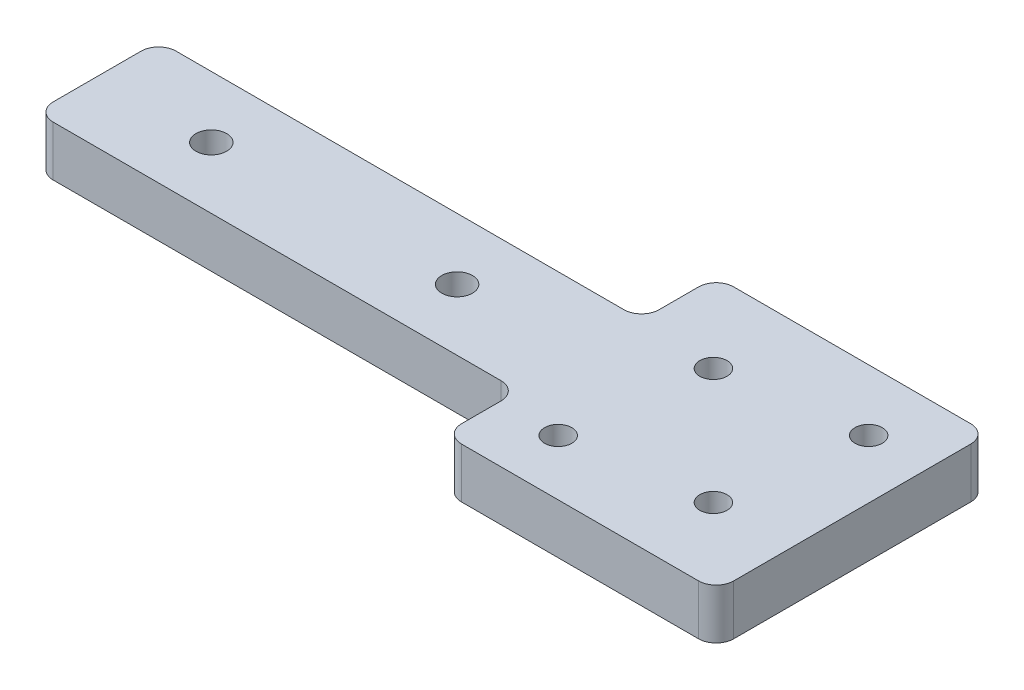
ISO-10303-21;
HEADER;
FILE_DESCRIPTION(('STEP AP214'),'2;1');
FILE_NAME('part.step','',(''),(''),'','','');
FILE_SCHEMA(('AUTOMOTIVE_DESIGN { 1 0 10303 214 1 1 1 1 }'));
ENDSEC;
DATA;
#1=APPLICATION_CONTEXT('core data for automotive mechanical design processes');
#2=APPLICATION_PROTOCOL_DEFINITION('international standard','automotive_design',2000,#1);
#3=PRODUCT_CONTEXT('',#1,'mechanical');
#4=PRODUCT('Part','Part','',(#3));
#5=PRODUCT_RELATED_PRODUCT_CATEGORY('part','',(#4));
#6=PRODUCT_DEFINITION_FORMATION('','',#4);
#7=PRODUCT_DEFINITION_CONTEXT('part definition',#1,'design');
#8=PRODUCT_DEFINITION('design','',#6,#7);
#9=PRODUCT_DEFINITION_SHAPE('','',#8);
#10=(LENGTH_UNIT() NAMED_UNIT(*) SI_UNIT(.MILLI.,.METRE.));
#11=(NAMED_UNIT(*) PLANE_ANGLE_UNIT() SI_UNIT($,.RADIAN.));
#12=(NAMED_UNIT(*) SI_UNIT($,.STERADIAN.) SOLID_ANGLE_UNIT());
#13=UNCERTAINTY_MEASURE_WITH_UNIT(LENGTH_MEASURE(1.E-05),#10,'distance_accuracy_value','');
#14=(GEOMETRIC_REPRESENTATION_CONTEXT(3) GLOBAL_UNCERTAINTY_ASSIGNED_CONTEXT((#13)) GLOBAL_UNIT_ASSIGNED_CONTEXT((#10,
#11,#12)) REPRESENTATION_CONTEXT('',''));
#15=CARTESIAN_POINT('',(0.,0.,0.));
#16=DIRECTION('',(0.,0.,1.));
#17=DIRECTION('',(1.,0.,0.));
#18=AXIS2_PLACEMENT_3D('',#15,#16,#17);
#19=CARTESIAN_POINT('',(-4.44992328999122,5.715,-7.31043064824472));
#20=DIRECTION('',(1.,0.,0.));
#21=DIRECTION('',(0.,0.,-1.));
#22=AXIS2_PLACEMENT_3D('',#19,#20,#21);
#23=PLANE('',#22);
#24=DIRECTION('',(0.,0.,1.));
#25=VECTOR('',#24,1.);
#26=CARTESIAN_POINT('',(-4.44992328999122,5.715,-7.31043064824472));
#27=LINE('',#26,#25);
#28=CARTESIAN_POINT('',(-4.44992328999122,5.715,-5.31043064824472));
#29=VERTEX_POINT('',#28);
#30=CARTESIAN_POINT('',(-4.44992328999122,5.715,4.68956935175528));
#31=VERTEX_POINT('',#30);
#32=EDGE_CURVE('E164',#29,#31,#27,.T.);
#33=ORIENTED_EDGE('',*,*,#32,.F.);
#34=DIRECTION('',(0.,-1.,0.));
#35=VECTOR('',#34,1.);
#36=CARTESIAN_POINT('',(-4.44992328999122,5.715,-5.31043064824472));
#37=LINE('',#36,#35);
#38=CARTESIAN_POINT('',(-4.44992328999122,0.,-5.31043064824472));
#39=VERTEX_POINT('',#38);
#40=EDGE_CURVE('E149',#29,#39,#37,.T.);
#41=ORIENTED_EDGE('',*,*,#40,.T.);
#42=DIRECTION('',(0.,0.,1.));
#43=VECTOR('',#42,1.);
#44=CARTESIAN_POINT('',(-4.44992328999122,0.,-7.31043064824472));
#45=LINE('',#44,#43);
#46=CARTESIAN_POINT('',(-4.44992328999122,0.,4.68956935175528));
#47=VERTEX_POINT('',#46);
#48=EDGE_CURVE('E161',#39,#47,#45,.T.);
#49=ORIENTED_EDGE('',*,*,#48,.T.);
#50=DIRECTION('',(0.,-1.,0.));
#51=VECTOR('',#50,1.);
#52=CARTESIAN_POINT('',(-4.44992328999122,5.715,4.68956935175528));
#53=LINE('',#52,#51);
#54=EDGE_CURVE('E166',#47,#31,#53,.F.);
#55=ORIENTED_EDGE('',*,*,#54,.T.);
#56=EDGE_LOOP('',(#33,#41,#49,#55));
#57=FACE_BOUND('',#56,.T.);
#58=ADVANCED_FACE('F32',(#57),#23,.F.);
#59=CARTESIAN_POINT('',(-4.44992328999122,5.715,6.68956935175528));
#60=DIRECTION('',(0.,0.,-1.));
#61=DIRECTION('',(-1.,0.,0.));
#62=AXIS2_PLACEMENT_3D('',#59,#60,#61);
#63=PLANE('',#62);
#64=DIRECTION('',(1.,0.,0.));
#65=VECTOR('',#64,1.);
#66=CARTESIAN_POINT('',(-4.44992328999122,5.715,6.68956935175528));
#67=LINE('',#66,#65);
#68=CARTESIAN_POINT('',(-2.44992328999122,5.715,6.68956935175528));
#69=VERTEX_POINT('',#68);
#70=CARTESIAN_POINT('',(48.5500767100088,5.715,6.68956935175528));
#71=VERTEX_POINT('',#70);
#72=EDGE_CURVE('E202',#69,#71,#67,.T.);
#73=ORIENTED_EDGE('',*,*,#72,.F.);
#74=DIRECTION('',(0.,-1.,0.));
#75=VECTOR('',#74,1.);
#76=CARTESIAN_POINT('',(-2.44992328999122,5.715,6.68956935175528));
#77=LINE('',#76,#75);
#78=CARTESIAN_POINT('',(-2.44992328999122,0.,6.68956935175528));
#79=VERTEX_POINT('',#78);
#80=EDGE_CURVE('E258',#69,#79,#77,.T.);
#81=ORIENTED_EDGE('',*,*,#80,.T.);
#82=DIRECTION('',(1.,0.,0.));
#83=VECTOR('',#82,1.);
#84=CARTESIAN_POINT('',(-4.44992328999122,0.,6.68956935175528));
#85=LINE('',#84,#83);
#86=CARTESIAN_POINT('',(48.5500767100088,0.,6.68956935175528));
#87=VERTEX_POINT('',#86);
#88=EDGE_CURVE('E170',#79,#87,#85,.T.);
#89=ORIENTED_EDGE('',*,*,#88,.T.);
#90=DIRECTION('',(0.,-1.,0.));
#91=VECTOR('',#90,1.);
#92=CARTESIAN_POINT('',(48.5500767100088,5.715,6.68956935175528));
#93=LINE('',#92,#91);
#94=EDGE_CURVE('E255',#87,#71,#93,.F.);
#95=ORIENTED_EDGE('',*,*,#94,.T.);
#96=EDGE_LOOP('',(#73,#81,#89,#95));
#97=FACE_BOUND('',#96,.T.);
#98=ADVANCED_FACE('F298',(#97),#63,.F.);
#99=CARTESIAN_POINT('',(-4.44992328999122,5.715,-7.31043064824472));
#100=DIRECTION('',(0.,0.,1.));
#101=DIRECTION('',(1.,0.,0.));
#102=AXIS2_PLACEMENT_3D('',#99,#100,#101);
#103=PLANE('',#102);
#104=DIRECTION('',(-1.,0.,0.));
#105=VECTOR('',#104,1.);
#106=CARTESIAN_POINT('',(-4.44992328999122,0.,-7.31043064824472));
#107=LINE('',#106,#105);
#108=CARTESIAN_POINT('',(48.5500767100088,0.,-7.31043064824472));
#109=VERTEX_POINT('',#108);
#110=CARTESIAN_POINT('',(-2.44992328999122,0.,-7.31043064824472));
#111=VERTEX_POINT('',#110);
#112=EDGE_CURVE('E174',#109,#111,#107,.T.);
#113=ORIENTED_EDGE('',*,*,#112,.T.);
#114=DIRECTION('',(0.,-1.,0.));
#115=VECTOR('',#114,1.);
#116=CARTESIAN_POINT('',(-2.44992328999122,5.715,-7.31043064824472));
#117=LINE('',#116,#115);
#118=CARTESIAN_POINT('',(-2.44992328999122,5.715,-7.31043064824472));
#119=VERTEX_POINT('',#118);
#120=EDGE_CURVE('E150',#111,#119,#117,.F.);
#121=ORIENTED_EDGE('',*,*,#120,.T.);
#122=DIRECTION('',(-1.,0.,0.));
#123=VECTOR('',#122,1.);
#124=CARTESIAN_POINT('',(-4.44992328999122,5.715,-7.31043064824472));
#125=LINE('',#124,#123);
#126=CARTESIAN_POINT('',(48.5500767100088,5.715,-7.31043064824472));
#127=VERTEX_POINT('',#126);
#128=EDGE_CURVE('E199',#127,#119,#125,.T.);
#129=ORIENTED_EDGE('',*,*,#128,.F.);
#130=DIRECTION('',(0.,-1.,0.));
#131=VECTOR('',#130,1.);
#132=CARTESIAN_POINT('',(48.5500767100088,5.715,-7.31043064824472));
#133=LINE('',#132,#131);
#134=EDGE_CURVE('E155',#127,#109,#133,.T.);
#135=ORIENTED_EDGE('',*,*,#134,.T.);
#136=EDGE_LOOP('',(#113,#121,#129,#135));
#137=FACE_BOUND('',#136,.T.);
#138=ADVANCED_FACE('F245',(#137),#103,.F.);
#139=CARTESIAN_POINT('',(0.,5.715,0.));
#140=DIRECTION('',(0.,1.,0.));
#141=DIRECTION('',(0.,0.,1.));
#142=AXIS2_PLACEMENT_3D('',#139,#140,#141);
#143=PLANE('',#142);
#144=CARTESIAN_POINT('',(72.661525114103,5.715,6.61144840409427));
#145=DIRECTION('',(0.,1.,0.));
#146=DIRECTION('',(0.,0.,1.));
#147=AXIS2_PLACEMENT_3D('',#144,#145,#146);
#148=CIRCLE('',#147,1.55);
#149=CARTESIAN_POINT('',(72.661525114103,5.715,8.16144840409427));
#150=VERTEX_POINT('',#149);
#151=EDGE_CURVE('E352',#150,#150,#148,.T.);
#152=ORIENTED_EDGE('',*,*,#151,.F.);
#153=EDGE_LOOP('',(#152));
#154=FACE_BOUND('',#153,.T.);
#155=CARTESIAN_POINT('',(74.8889114748407,5.715,-8.83883476483178));
#156=DIRECTION('',(0.,1.,0.));
#157=DIRECTION('',(0.,0.,1.));
#158=AXIS2_PLACEMENT_3D('',#155,#156,#157);
#159=CIRCLE('',#158,1.54999999999998);
#160=CARTESIAN_POINT('',(74.8889114748407,5.715,-7.28883476483179));
#161=VERTEX_POINT('',#160);
#162=EDGE_CURVE('E348',#161,#161,#159,.T.);
#163=ORIENTED_EDGE('',*,*,#162,.F.);
#164=EDGE_LOOP('',(#163));
#165=FACE_BOUND('',#164,.T.);
#166=CARTESIAN_POINT('',(59.4386283059146,5.715,-6.61144840409424));
#167=DIRECTION('',(0.,1.,0.));
#168=DIRECTION('',(0.,0.,1.));
#169=AXIS2_PLACEMENT_3D('',#166,#167,#168);
#170=CIRCLE('',#169,1.54999999999999);
#171=CARTESIAN_POINT('',(59.4386283059146,5.715,-5.06144840409425));
#172=VERTEX_POINT('',#171);
#173=EDGE_CURVE('E344',#172,#172,#170,.T.);
#174=ORIENTED_EDGE('',*,*,#173,.F.);
#175=EDGE_LOOP('',(#174));
#176=FACE_BOUND('',#175,.T.);
#177=CARTESIAN_POINT('',(57.2112419451769,5.715,8.8388347648318));
#178=DIRECTION('',(0.,1.,0.));
#179=DIRECTION('',(0.,0.,1.));
#180=AXIS2_PLACEMENT_3D('',#177,#178,#179);
#181=CIRCLE('',#180,1.55000000000001);
#182=CARTESIAN_POINT('',(57.2112419451769,5.715,10.3888347648318));
#183=VERTEX_POINT('',#182);
#184=EDGE_CURVE('E313',#183,#183,#181,.T.);
#185=ORIENTED_EDGE('',*,*,#184,.F.);
#186=EDGE_LOOP('',(#185));
#187=FACE_BOUND('',#186,.T.);
#188=CARTESIAN_POINT('',(36.5500767100088,5.715,-0.310430648244709));
#189=DIRECTION('',(0.,1.,0.));
#190=DIRECTION('',(0.,0.,1.));
#191=AXIS2_PLACEMENT_3D('',#188,#189,#190);
#192=CIRCLE('',#191,1.75);
#193=CARTESIAN_POINT('',(36.5500767100088,5.715,1.43956935175529));
#194=VERTEX_POINT('',#193);
#195=EDGE_CURVE('E233',#194,#194,#192,.T.);
#196=ORIENTED_EDGE('',*,*,#195,.F.);
#197=EDGE_LOOP('',(#196));
#198=FACE_BOUND('',#197,.T.);
#199=CARTESIAN_POINT('',(8.55007671000879,5.715,-0.31043064824469));
#200=DIRECTION('',(0.,1.,0.));
#201=DIRECTION('',(0.,0.,1.));
#202=AXIS2_PLACEMENT_3D('',#199,#200,#201);
#203=CIRCLE('',#202,1.75);
#204=CARTESIAN_POINT('',(8.55007671000879,5.715,1.43956935175531));
#205=VERTEX_POINT('',#204);
#206=EDGE_CURVE('E177',#205,#205,#203,.T.);
#207=ORIENTED_EDGE('',*,*,#206,.F.);
#208=EDGE_LOOP('',(#207));
#209=FACE_BOUND('',#208,.T.);
#210=ORIENTED_EDGE('',*,*,#128,.T.);
#211=CARTESIAN_POINT('',(-2.44992328999122,5.715,-5.31043064824472));
#212=DIRECTION('',(0.,1.,0.));
#213=DIRECTION('',(0.,0.,1.));
#214=AXIS2_PLACEMENT_3D('',#211,#212,#213);
#215=CIRCLE('',#214,2.);
#216=EDGE_CURVE('E249',#119,#29,#215,.T.);
#217=ORIENTED_EDGE('',*,*,#216,.T.);
#218=ORIENTED_EDGE('',*,*,#32,.T.);
#219=CARTESIAN_POINT('',(-2.44992328999122,5.715,4.68956935175528));
#220=DIRECTION('',(0.,1.,0.));
#221=DIRECTION('',(0.,0.,1.));
#222=AXIS2_PLACEMENT_3D('',#219,#220,#221);
#223=CIRCLE('',#222,2.);
#224=EDGE_CURVE('E256',#31,#69,#223,.T.);
#225=ORIENTED_EDGE('',*,*,#224,.T.);
#226=ORIENTED_EDGE('',*,*,#72,.T.);
#227=CARTESIAN_POINT('',(48.5500767100088,5.715,8.68956935175528));
#228=DIRECTION('',(0.,1.,0.));
#229=DIRECTION('',(0.,0.,1.));
#230=AXIS2_PLACEMENT_3D('',#227,#228,#229);
#231=CIRCLE('',#230,2.);
#232=CARTESIAN_POINT('',(50.5500767100088,5.715,8.68956935175528));
#233=VERTEX_POINT('',#232);
#234=EDGE_CURVE('E11',#71,#233,#231,.F.);
#235=ORIENTED_EDGE('',*,*,#234,.T.);
#236=DIRECTION('',(0.,0.,1.));
#237=VECTOR('',#236,1.);
#238=CARTESIAN_POINT('',(50.5500767100088,5.715,-15.8104306482447));
#239=LINE('',#238,#237);
#240=CARTESIAN_POINT('',(50.5500767100088,5.715,13.1895693517553));
#241=VERTEX_POINT('',#240);
#242=EDGE_CURVE('E305',#233,#241,#239,.T.);
#243=ORIENTED_EDGE('',*,*,#242,.T.);
#244=CARTESIAN_POINT('',(52.5500767100088,5.715,13.1895693517553));
#245=DIRECTION('',(0.,1.,0.));
#246=DIRECTION('',(0.,0.,1.));
#247=AXIS2_PLACEMENT_3D('',#244,#245,#246);
#248=CIRCLE('',#247,2.);
#249=CARTESIAN_POINT('',(52.5500767100088,5.715,15.1895693517553));
#250=VERTEX_POINT('',#249);
#251=EDGE_CURVE('E316',#241,#250,#248,.T.);
#252=ORIENTED_EDGE('',*,*,#251,.T.);
#253=DIRECTION('',(-1.,0.,0.));
#254=VECTOR('',#253,1.);
#255=CARTESIAN_POINT('',(81.5500767100088,5.715,15.1895693517553));
#256=LINE('',#255,#254);
#257=CARTESIAN_POINT('',(79.5500767100088,5.715,15.1895693517553));
#258=VERTEX_POINT('',#257);
#259=EDGE_CURVE('E228',#258,#250,#256,.T.);
#260=ORIENTED_EDGE('',*,*,#259,.F.);
#261=CARTESIAN_POINT('',(79.5500767100088,5.715,13.1895693517553));
#262=DIRECTION('',(0.,1.,0.));
#263=DIRECTION('',(0.,0.,1.));
#264=AXIS2_PLACEMENT_3D('',#261,#262,#263);
#265=CIRCLE('',#264,2.);
#266=CARTESIAN_POINT('',(81.5500767100088,5.715,13.1895693517553));
#267=VERTEX_POINT('',#266);
#268=EDGE_CURVE('E318',#258,#267,#265,.T.);
#269=ORIENTED_EDGE('',*,*,#268,.T.);
#270=DIRECTION('',(0.,0.,1.));
#271=VECTOR('',#270,1.);
#272=CARTESIAN_POINT('',(81.5500767100088,5.715,-15.8104306482447));
#273=LINE('',#272,#271);
#274=CARTESIAN_POINT('',(81.5500767100088,5.715,-13.8104306482447));
#275=VERTEX_POINT('',#274);
#276=EDGE_CURVE('E324',#275,#267,#273,.T.);
#277=ORIENTED_EDGE('',*,*,#276,.F.);
#278=CARTESIAN_POINT('',(79.5500767100088,5.715,-13.8104306482447));
#279=DIRECTION('',(0.,1.,0.));
#280=DIRECTION('',(0.,0.,1.));
#281=AXIS2_PLACEMENT_3D('',#278,#279,#280);
#282=CIRCLE('',#281,2.);
#283=CARTESIAN_POINT('',(79.5500767100088,5.715,-15.8104306482447));
#284=VERTEX_POINT('',#283);
#285=EDGE_CURVE('E320',#275,#284,#282,.T.);
#286=ORIENTED_EDGE('',*,*,#285,.T.);
#287=DIRECTION('',(-1.,0.,0.));
#288=VECTOR('',#287,1.);
#289=CARTESIAN_POINT('',(81.5500767100088,5.715,-15.8104306482447));
#290=LINE('',#289,#288);
#291=CARTESIAN_POINT('',(52.5500767100088,5.715,-15.8104306482447));
#292=VERTEX_POINT('',#291);
#293=EDGE_CURVE('E231',#284,#292,#290,.T.);
#294=ORIENTED_EDGE('',*,*,#293,.T.);
#295=CARTESIAN_POINT('',(52.5500767100088,5.715,-13.8104306482447));
#296=DIRECTION('',(0.,1.,0.));
#297=DIRECTION('',(0.,0.,1.));
#298=AXIS2_PLACEMENT_3D('',#295,#296,#297);
#299=CIRCLE('',#298,2.);
#300=CARTESIAN_POINT('',(50.5500767100088,5.715,-13.8104306482447));
#301=VERTEX_POINT('',#300);
#302=EDGE_CURVE('E54',#292,#301,#299,.T.);
#303=ORIENTED_EDGE('',*,*,#302,.T.);
#304=CARTESIAN_POINT('',(50.5500767100088,5.715,-9.31043064824472));
#305=VERTEX_POINT('',#304);
#306=EDGE_CURVE('E214',#301,#305,#239,.T.);
#307=ORIENTED_EDGE('',*,*,#306,.T.);
#308=CARTESIAN_POINT('',(48.5500767100088,5.715,-9.31043064824472));
#309=DIRECTION('',(0.,1.,0.));
#310=DIRECTION('',(0.,0.,1.));
#311=AXIS2_PLACEMENT_3D('',#308,#309,#310);
#312=CIRCLE('',#311,2.);
#313=EDGE_CURVE('E251',#305,#127,#312,.F.);
#314=ORIENTED_EDGE('',*,*,#313,.T.);
#315=EDGE_LOOP('',(#210,#217,#218,#225,#226,#235,#243,#252,#260,#269,#277,#286,#294,#303,#307,#314));
#316=FACE_BOUND('',#315,.T.);
#317=ADVANCED_FACE('F243',(#154,#165,#176,#187,#198,#209,#316),#143,.T.);
#318=CARTESIAN_POINT('',(0.,0.,0.));
#319=DIRECTION('',(0.,1.,0.));
#320=DIRECTION('',(0.,0.,1.));
#321=AXIS2_PLACEMENT_3D('',#318,#319,#320);
#322=PLANE('',#321);
#323=CARTESIAN_POINT('',(72.661525114103,0.,6.61144840409427));
#324=DIRECTION('',(0.,1.,0.));
#325=DIRECTION('',(0.,0.,1.));
#326=AXIS2_PLACEMENT_3D('',#323,#324,#325);
#327=CIRCLE('',#326,1.55);
#328=CARTESIAN_POINT('',(72.661525114103,0.,8.16144840409427));
#329=VERTEX_POINT('',#328);
#330=EDGE_CURVE('E351',#329,#329,#327,.T.);
#331=ORIENTED_EDGE('',*,*,#330,.T.);
#332=EDGE_LOOP('',(#331));
#333=FACE_BOUND('',#332,.T.);
#334=CARTESIAN_POINT('',(74.8889114748407,0.,-8.83883476483178));
#335=DIRECTION('',(0.,1.,0.));
#336=DIRECTION('',(0.,0.,1.));
#337=AXIS2_PLACEMENT_3D('',#334,#335,#336);
#338=CIRCLE('',#337,1.54999999999998);
#339=CARTESIAN_POINT('',(74.8889114748407,0.,-7.28883476483179));
#340=VERTEX_POINT('',#339);
#341=EDGE_CURVE('E347',#340,#340,#338,.T.);
#342=ORIENTED_EDGE('',*,*,#341,.T.);
#343=EDGE_LOOP('',(#342));
#344=FACE_BOUND('',#343,.T.);
#345=CARTESIAN_POINT('',(59.4386283059146,0.,-6.61144840409424));
#346=DIRECTION('',(0.,1.,0.));
#347=DIRECTION('',(0.,0.,1.));
#348=AXIS2_PLACEMENT_3D('',#345,#346,#347);
#349=CIRCLE('',#348,1.54999999999999);
#350=CARTESIAN_POINT('',(59.4386283059146,0.,-5.06144840409425));
#351=VERTEX_POINT('',#350);
#352=EDGE_CURVE('E343',#351,#351,#349,.T.);
#353=ORIENTED_EDGE('',*,*,#352,.T.);
#354=EDGE_LOOP('',(#353));
#355=FACE_BOUND('',#354,.T.);
#356=CARTESIAN_POINT('',(57.2112419451769,0.,8.8388347648318));
#357=DIRECTION('',(0.,1.,0.));
#358=DIRECTION('',(0.,0.,1.));
#359=AXIS2_PLACEMENT_3D('',#356,#357,#358);
#360=CIRCLE('',#359,1.55000000000001);
#361=CARTESIAN_POINT('',(57.2112419451769,0.,10.3888347648318));
#362=VERTEX_POINT('',#361);
#363=EDGE_CURVE('E208',#362,#362,#360,.T.);
#364=ORIENTED_EDGE('',*,*,#363,.T.);
#365=EDGE_LOOP('',(#364));
#366=FACE_BOUND('',#365,.T.);
#367=CARTESIAN_POINT('',(36.5500767100088,0.,-0.310430648244709));
#368=DIRECTION('',(0.,1.,0.));
#369=DIRECTION('',(0.,0.,1.));
#370=AXIS2_PLACEMENT_3D('',#367,#368,#369);
#371=CIRCLE('',#370,1.75);
#372=CARTESIAN_POINT('',(36.5500767100088,0.,1.43956935175529));
#373=VERTEX_POINT('',#372);
#374=EDGE_CURVE('E234',#373,#373,#371,.T.);
#375=ORIENTED_EDGE('',*,*,#374,.T.);
#376=EDGE_LOOP('',(#375));
#377=FACE_BOUND('',#376,.T.);
#378=CARTESIAN_POINT('',(8.55007671000879,0.,-0.31043064824469));
#379=DIRECTION('',(0.,1.,0.));
#380=DIRECTION('',(0.,0.,1.));
#381=AXIS2_PLACEMENT_3D('',#378,#379,#380);
#382=CIRCLE('',#381,1.75);
#383=CARTESIAN_POINT('',(8.55007671000879,0.,1.43956935175531));
#384=VERTEX_POINT('',#383);
#385=EDGE_CURVE('E171',#384,#384,#382,.T.);
#386=ORIENTED_EDGE('',*,*,#385,.T.);
#387=EDGE_LOOP('',(#386));
#388=FACE_BOUND('',#387,.T.);
#389=ORIENTED_EDGE('',*,*,#48,.F.);
#390=CARTESIAN_POINT('',(-2.44992328999122,0.,-5.31043064824472));
#391=DIRECTION('',(0.,1.,0.));
#392=DIRECTION('',(0.,0.,1.));
#393=AXIS2_PLACEMENT_3D('',#390,#391,#392);
#394=CIRCLE('',#393,2.);
#395=EDGE_CURVE('E145',#39,#111,#394,.F.);
#396=ORIENTED_EDGE('',*,*,#395,.T.);
#397=ORIENTED_EDGE('',*,*,#112,.F.);
#398=CARTESIAN_POINT('',(48.5500767100088,0.,-9.31043064824472));
#399=DIRECTION('',(0.,1.,0.));
#400=DIRECTION('',(0.,0.,1.));
#401=AXIS2_PLACEMENT_3D('',#398,#399,#400);
#402=CIRCLE('',#401,2.);
#403=CARTESIAN_POINT('',(50.5500767100088,0.,-9.31043064824472));
#404=VERTEX_POINT('',#403);
#405=EDGE_CURVE('E289',#109,#404,#402,.T.);
#406=ORIENTED_EDGE('',*,*,#405,.T.);
#407=DIRECTION('',(0.,0.,-1.));
#408=VECTOR('',#407,1.);
#409=CARTESIAN_POINT('',(50.5500767100088,0.,-15.8104306482447));
#410=LINE('',#409,#408);
#411=CARTESIAN_POINT('',(50.5500767100088,0.,-13.8104306482447));
#412=VERTEX_POINT('',#411);
#413=EDGE_CURVE('E212',#404,#412,#410,.T.);
#414=ORIENTED_EDGE('',*,*,#413,.T.);
#415=CARTESIAN_POINT('',(52.5500767100088,0.,-13.8104306482447));
#416=DIRECTION('',(0.,1.,0.));
#417=DIRECTION('',(0.,0.,1.));
#418=AXIS2_PLACEMENT_3D('',#415,#416,#417);
#419=CIRCLE('',#418,2.);
#420=CARTESIAN_POINT('',(52.5500767100088,0.,-15.8104306482447));
#421=VERTEX_POINT('',#420);
#422=EDGE_CURVE('E196',#412,#421,#419,.F.);
#423=ORIENTED_EDGE('',*,*,#422,.T.);
#424=DIRECTION('',(-1.,0.,0.));
#425=VECTOR('',#424,1.);
#426=CARTESIAN_POINT('',(81.5500767100088,0.,-15.8104306482447));
#427=LINE('',#426,#425);
#428=CARTESIAN_POINT('',(79.5500767100088,0.,-15.8104306482447));
#429=VERTEX_POINT('',#428);
#430=EDGE_CURVE('E220',#429,#421,#427,.T.);
#431=ORIENTED_EDGE('',*,*,#430,.F.);
#432=CARTESIAN_POINT('',(79.5500767100088,0.,-13.8104306482447));
#433=DIRECTION('',(0.,1.,0.));
#434=DIRECTION('',(0.,0.,1.));
#435=AXIS2_PLACEMENT_3D('',#432,#433,#434);
#436=CIRCLE('',#435,2.);
#437=CARTESIAN_POINT('',(81.5500767100088,0.,-13.8104306482447));
#438=VERTEX_POINT('',#437);
#439=EDGE_CURVE('E194',#429,#438,#436,.F.);
#440=ORIENTED_EDGE('',*,*,#439,.T.);
#441=DIRECTION('',(0.,0.,-1.));
#442=VECTOR('',#441,1.);
#443=CARTESIAN_POINT('',(81.5500767100088,0.,-15.8104306482447));
#444=LINE('',#443,#442);
#445=CARTESIAN_POINT('',(81.5500767100088,0.,13.1895693517553));
#446=VERTEX_POINT('',#445);
#447=EDGE_CURVE('E225',#446,#438,#444,.T.);
#448=ORIENTED_EDGE('',*,*,#447,.F.);
#449=CARTESIAN_POINT('',(79.5500767100088,0.,13.1895693517553));
#450=DIRECTION('',(0.,1.,0.));
#451=DIRECTION('',(0.,0.,1.));
#452=AXIS2_PLACEMENT_3D('',#449,#450,#451);
#453=CIRCLE('',#452,2.);
#454=CARTESIAN_POINT('',(79.5500767100088,0.,15.1895693517553));
#455=VERTEX_POINT('',#454);
#456=EDGE_CURVE('E192',#446,#455,#453,.F.);
#457=ORIENTED_EDGE('',*,*,#456,.T.);
#458=DIRECTION('',(-1.,0.,0.));
#459=VECTOR('',#458,1.);
#460=CARTESIAN_POINT('',(81.5500767100088,0.,15.1895693517553));
#461=LINE('',#460,#459);
#462=CARTESIAN_POINT('',(52.5500767100088,0.,15.1895693517553));
#463=VERTEX_POINT('',#462);
#464=EDGE_CURVE('E224',#455,#463,#461,.T.);
#465=ORIENTED_EDGE('',*,*,#464,.T.);
#466=CARTESIAN_POINT('',(52.5500767100088,0.,13.1895693517553));
#467=DIRECTION('',(0.,1.,0.));
#468=DIRECTION('',(0.,0.,1.));
#469=AXIS2_PLACEMENT_3D('',#466,#467,#468);
#470=CIRCLE('',#469,2.);
#471=CARTESIAN_POINT('',(50.5500767100088,0.,13.1895693517553));
#472=VERTEX_POINT('',#471);
#473=EDGE_CURVE('E165',#463,#472,#470,.F.);
#474=ORIENTED_EDGE('',*,*,#473,.T.);
#475=CARTESIAN_POINT('',(50.5500767100088,0.,8.68956935175528));
#476=VERTEX_POINT('',#475);
#477=EDGE_CURVE('E188',#472,#476,#410,.T.);
#478=ORIENTED_EDGE('',*,*,#477,.T.);
#479=CARTESIAN_POINT('',(48.5500767100088,0.,8.68956935175528));
#480=DIRECTION('',(0.,1.,0.));
#481=DIRECTION('',(0.,0.,1.));
#482=AXIS2_PLACEMENT_3D('',#479,#480,#481);
#483=CIRCLE('',#482,2.);
#484=EDGE_CURVE('E40',#476,#87,#483,.T.);
#485=ORIENTED_EDGE('',*,*,#484,.T.);
#486=ORIENTED_EDGE('',*,*,#88,.F.);
#487=CARTESIAN_POINT('',(-2.44992328999122,0.,4.68956935175528));
#488=DIRECTION('',(0.,1.,0.));
#489=DIRECTION('',(0.,0.,1.));
#490=AXIS2_PLACEMENT_3D('',#487,#488,#489);
#491=CIRCLE('',#490,2.);
#492=EDGE_CURVE('E156',#79,#47,#491,.F.);
#493=ORIENTED_EDGE('',*,*,#492,.T.);
#494=EDGE_LOOP('',(#389,#396,#397,#406,#414,#423,#431,#440,#448,#457,#465,#474,#478,#485,#486,#493));
#495=FACE_BOUND('',#494,.T.);
#496=ADVANCED_FACE('F168',(#333,#344,#355,#366,#377,#388,#495),#322,.F.);
#497=CARTESIAN_POINT('',(8.55007671000879,0.,-0.31043064824469));
#498=DIRECTION('',(0.,1.,0.));
#499=DIRECTION('',(0.,0.,1.));
#500=AXIS2_PLACEMENT_3D('',#497,#498,#499);
#501=CYLINDRICAL_SURFACE('',#500,1.75);
#502=ORIENTED_EDGE('',*,*,#385,.F.);
#503=EDGE_LOOP('',(#502));
#504=FACE_BOUND('',#503,.T.);
#505=ORIENTED_EDGE('',*,*,#206,.T.);
#506=EDGE_LOOP('',(#505));
#507=FACE_BOUND('',#506,.T.);
#508=ADVANCED_FACE('F241',(#504,#507),#501,.F.);
#509=CARTESIAN_POINT('',(36.5500767100088,0.,-0.310430648244709));
#510=DIRECTION('',(0.,1.,0.));
#511=DIRECTION('',(0.,0.,1.));
#512=AXIS2_PLACEMENT_3D('',#509,#510,#511);
#513=CYLINDRICAL_SURFACE('',#512,1.75);
#514=ORIENTED_EDGE('',*,*,#374,.F.);
#515=EDGE_LOOP('',(#514));
#516=FACE_BOUND('',#515,.T.);
#517=ORIENTED_EDGE('',*,*,#195,.T.);
#518=EDGE_LOOP('',(#517));
#519=FACE_BOUND('',#518,.T.);
#520=ADVANCED_FACE('F388',(#516,#519),#513,.F.);
#521=CARTESIAN_POINT('',(50.5500767100088,0.,0.));
#522=DIRECTION('',(-1.,0.,0.));
#523=DIRECTION('',(0.,0.,1.));
#524=AXIS2_PLACEMENT_3D('',#521,#522,#523);
#525=PLANE('',#524);
#526=ORIENTED_EDGE('',*,*,#413,.F.);
#527=DIRECTION('',(0.,-1.,0.));
#528=VECTOR('',#527,1.);
#529=CARTESIAN_POINT('',(50.5500767100088,0.,-9.31043064824472));
#530=LINE('',#529,#528);
#531=EDGE_CURVE('E47',#404,#305,#530,.F.);
#532=ORIENTED_EDGE('',*,*,#531,.T.);
#533=ORIENTED_EDGE('',*,*,#306,.F.);
#534=DIRECTION('',(0.,1.,0.));
#535=VECTOR('',#534,1.);
#536=CARTESIAN_POINT('',(50.5500767100088,0.,-13.8104306482447));
#537=LINE('',#536,#535);
#538=EDGE_CURVE('E265',#301,#412,#537,.F.);
#539=ORIENTED_EDGE('',*,*,#538,.T.);
#540=EDGE_LOOP('',(#526,#532,#533,#539));
#541=FACE_BOUND('',#540,.T.);
#542=ADVANCED_FACE('F392',(#541),#525,.T.);
#543=CARTESIAN_POINT('',(81.5500767100088,5.715,-15.8104306482447));
#544=DIRECTION('',(0.,0.,1.));
#545=DIRECTION('',(0.,-1.,0.));
#546=AXIS2_PLACEMENT_3D('',#543,#544,#545);
#547=PLANE('',#546);
#548=ORIENTED_EDGE('',*,*,#430,.T.);
#549=DIRECTION('',(0.,1.,0.));
#550=VECTOR('',#549,1.);
#551=CARTESIAN_POINT('',(52.5500767100088,5.715,-15.8104306482447));
#552=LINE('',#551,#550);
#553=EDGE_CURVE('E275',#421,#292,#552,.T.);
#554=ORIENTED_EDGE('',*,*,#553,.T.);
#555=ORIENTED_EDGE('',*,*,#293,.F.);
#556=DIRECTION('',(0.,1.,0.));
#557=VECTOR('',#556,1.);
#558=CARTESIAN_POINT('',(79.5500767100088,5.715,-15.8104306482447));
#559=LINE('',#558,#557);
#560=EDGE_CURVE('E273',#284,#429,#559,.F.);
#561=ORIENTED_EDGE('',*,*,#560,.T.);
#562=EDGE_LOOP('',(#548,#554,#555,#561));
#563=FACE_BOUND('',#562,.T.);
#564=ADVANCED_FACE('F329',(#563),#547,.F.);
#565=CARTESIAN_POINT('',(81.5500767100088,5.715,15.1895693517553));
#566=DIRECTION('',(0.,0.,-1.));
#567=DIRECTION('',(-1.,0.,0.));
#568=AXIS2_PLACEMENT_3D('',#565,#566,#567);
#569=PLANE('',#568);
#570=ORIENTED_EDGE('',*,*,#464,.F.);
#571=DIRECTION('',(0.,-1.,0.));
#572=VECTOR('',#571,1.);
#573=CARTESIAN_POINT('',(79.5500767100088,5.715,15.1895693517553));
#574=LINE('',#573,#572);
#575=EDGE_CURVE('E287',#455,#258,#574,.F.);
#576=ORIENTED_EDGE('',*,*,#575,.T.);
#577=ORIENTED_EDGE('',*,*,#259,.T.);
#578=DIRECTION('',(0.,-1.,0.));
#579=VECTOR('',#578,1.);
#580=CARTESIAN_POINT('',(52.5500767100088,0.,15.1895693517553));
#581=LINE('',#580,#579);
#582=EDGE_CURVE('E284',#250,#463,#581,.T.);
#583=ORIENTED_EDGE('',*,*,#582,.T.);
#584=EDGE_LOOP('',(#570,#576,#577,#583));
#585=FACE_BOUND('',#584,.T.);
#586=ADVANCED_FACE('F396',(#585),#569,.F.);
#587=CARTESIAN_POINT('',(81.5500767100088,0.,0.));
#588=DIRECTION('',(-1.,0.,0.));
#589=DIRECTION('',(0.,0.,1.));
#590=AXIS2_PLACEMENT_3D('',#587,#588,#589);
#591=PLANE('',#590);
#592=ORIENTED_EDGE('',*,*,#447,.T.);
#593=DIRECTION('',(0.,1.,0.));
#594=VECTOR('',#593,1.);
#595=CARTESIAN_POINT('',(81.5500767100088,0.,-13.8104306482447));
#596=LINE('',#595,#594);
#597=EDGE_CURVE('E281',#438,#275,#596,.T.);
#598=ORIENTED_EDGE('',*,*,#597,.T.);
#599=ORIENTED_EDGE('',*,*,#276,.T.);
#600=DIRECTION('',(0.,-1.,0.));
#601=VECTOR('',#600,1.);
#602=CARTESIAN_POINT('',(81.5500767100088,0.,13.1895693517553));
#603=LINE('',#602,#601);
#604=EDGE_CURVE('E278',#267,#446,#603,.T.);
#605=ORIENTED_EDGE('',*,*,#604,.T.);
#606=EDGE_LOOP('',(#592,#598,#599,#605));
#607=FACE_BOUND('',#606,.T.);
#608=ADVANCED_FACE('F337',(#607),#591,.F.);
#609=ORIENTED_EDGE('',*,*,#242,.F.);
#610=DIRECTION('',(0.,-1.,0.));
#611=VECTOR('',#610,1.);
#612=CARTESIAN_POINT('',(50.5500767100088,0.,8.68956935175528));
#613=LINE('',#612,#611);
#614=EDGE_CURVE('E270',#233,#476,#613,.T.);
#615=ORIENTED_EDGE('',*,*,#614,.T.);
#616=ORIENTED_EDGE('',*,*,#477,.F.);
#617=DIRECTION('',(0.,-1.,0.));
#618=VECTOR('',#617,1.);
#619=CARTESIAN_POINT('',(50.5500767100088,5.715,13.1895693517553));
#620=LINE('',#619,#618);
#621=EDGE_CURVE('E268',#472,#241,#620,.F.);
#622=ORIENTED_EDGE('',*,*,#621,.T.);
#623=EDGE_LOOP('',(#609,#615,#616,#622));
#624=FACE_BOUND('',#623,.T.);
#625=ADVANCED_FACE('F308',(#624),#525,.T.);
#626=CARTESIAN_POINT('',(57.2112419451769,-5.00000000023051E-05,8.8388347648318));
#627=DIRECTION('',(0.,1.,0.));
#628=DIRECTION('',(0.,0.,1.));
#629=AXIS2_PLACEMENT_3D('',#626,#627,#628);
#630=CYLINDRICAL_SURFACE('',#629,1.55000000000001);
#631=ORIENTED_EDGE('',*,*,#184,.T.);
#632=EDGE_LOOP('',(#631));
#633=FACE_BOUND('',#632,.T.);
#634=ORIENTED_EDGE('',*,*,#363,.F.);
#635=EDGE_LOOP('',(#634));
#636=FACE_BOUND('',#635,.T.);
#637=ADVANCED_FACE('F402',(#633,#636),#630,.F.);
#638=CARTESIAN_POINT('',(59.4386283059146,-5.00000000023051E-05,-6.61144840409424));
#639=DIRECTION('',(0.,1.,0.));
#640=DIRECTION('',(0.,0.,1.));
#641=AXIS2_PLACEMENT_3D('',#638,#639,#640);
#642=CYLINDRICAL_SURFACE('',#641,1.54999999999999);
#643=ORIENTED_EDGE('',*,*,#173,.T.);
#644=EDGE_LOOP('',(#643));
#645=FACE_BOUND('',#644,.T.);
#646=ORIENTED_EDGE('',*,*,#352,.F.);
#647=EDGE_LOOP('',(#646));
#648=FACE_BOUND('',#647,.T.);
#649=ADVANCED_FACE('F407',(#645,#648),#642,.F.);
#650=CARTESIAN_POINT('',(74.8889114748407,-5.00000000023051E-05,-8.83883476483178));
#651=DIRECTION('',(0.,1.,0.));
#652=DIRECTION('',(0.,0.,1.));
#653=AXIS2_PLACEMENT_3D('',#650,#651,#652);
#654=CYLINDRICAL_SURFACE('',#653,1.54999999999998);
#655=ORIENTED_EDGE('',*,*,#162,.T.);
#656=EDGE_LOOP('',(#655));
#657=FACE_BOUND('',#656,.T.);
#658=ORIENTED_EDGE('',*,*,#341,.F.);
#659=EDGE_LOOP('',(#658));
#660=FACE_BOUND('',#659,.T.);
#661=ADVANCED_FACE('F411',(#657,#660),#654,.F.);
#662=CARTESIAN_POINT('',(72.661525114103,-5.00000000023051E-05,6.61144840409427));
#663=DIRECTION('',(0.,1.,0.));
#664=DIRECTION('',(0.,0.,1.));
#665=AXIS2_PLACEMENT_3D('',#662,#663,#664);
#666=CYLINDRICAL_SURFACE('',#665,1.55);
#667=ORIENTED_EDGE('',*,*,#151,.T.);
#668=EDGE_LOOP('',(#667));
#669=FACE_BOUND('',#668,.T.);
#670=ORIENTED_EDGE('',*,*,#330,.F.);
#671=EDGE_LOOP('',(#670));
#672=FACE_BOUND('',#671,.T.);
#673=ADVANCED_FACE('F373',(#669,#672),#666,.F.);
#674=CARTESIAN_POINT('',(-2.44992328999122,5.715,-5.31043064824472));
#675=DIRECTION('',(0.,-1.,0.));
#676=DIRECTION('',(0.,0.,-1.));
#677=AXIS2_PLACEMENT_3D('',#674,#675,#676);
#678=CYLINDRICAL_SURFACE('',#677,2.);
#679=ORIENTED_EDGE('',*,*,#216,.F.);
#680=ORIENTED_EDGE('',*,*,#120,.F.);
#681=ORIENTED_EDGE('',*,*,#395,.F.);
#682=ORIENTED_EDGE('',*,*,#40,.F.);
#683=EDGE_LOOP('',(#679,#680,#681,#682));
#684=FACE_BOUND('',#683,.T.);
#685=ADVANCED_FACE('F148',(#684),#678,.T.);
#686=CARTESIAN_POINT('',(-2.44992328999122,5.715,4.68956935175528));
#687=DIRECTION('',(0.,-1.,0.));
#688=DIRECTION('',(0.,0.,-1.));
#689=AXIS2_PLACEMENT_3D('',#686,#687,#688);
#690=CYLINDRICAL_SURFACE('',#689,2.);
#691=ORIENTED_EDGE('',*,*,#224,.F.);
#692=ORIENTED_EDGE('',*,*,#54,.F.);
#693=ORIENTED_EDGE('',*,*,#492,.F.);
#694=ORIENTED_EDGE('',*,*,#80,.F.);
#695=EDGE_LOOP('',(#691,#692,#693,#694));
#696=FACE_BOUND('',#695,.T.);
#697=ADVANCED_FACE('F363',(#696),#690,.T.);
#698=CARTESIAN_POINT('',(48.5500767100088,5.715,-9.31043064824472));
#699=DIRECTION('',(0.,-1.,0.));
#700=DIRECTION('',(0.,0.,-1.));
#701=AXIS2_PLACEMENT_3D('',#698,#699,#700);
#702=CYLINDRICAL_SURFACE('',#701,2.);
#703=ORIENTED_EDGE('',*,*,#313,.F.);
#704=ORIENTED_EDGE('',*,*,#531,.F.);
#705=ORIENTED_EDGE('',*,*,#405,.F.);
#706=ORIENTED_EDGE('',*,*,#134,.F.);
#707=EDGE_LOOP('',(#703,#704,#705,#706));
#708=FACE_BOUND('',#707,.T.);
#709=ADVANCED_FACE('F365',(#708),#702,.F.);
#710=CARTESIAN_POINT('',(48.5500767100088,0.,8.68956935175528));
#711=DIRECTION('',(0.,-1.,0.));
#712=DIRECTION('',(0.,0.,-1.));
#713=AXIS2_PLACEMENT_3D('',#710,#711,#712);
#714=CYLINDRICAL_SURFACE('',#713,2.);
#715=ORIENTED_EDGE('',*,*,#234,.F.);
#716=ORIENTED_EDGE('',*,*,#94,.F.);
#717=ORIENTED_EDGE('',*,*,#484,.F.);
#718=ORIENTED_EDGE('',*,*,#614,.F.);
#719=EDGE_LOOP('',(#715,#716,#717,#718));
#720=FACE_BOUND('',#719,.T.);
#721=ADVANCED_FACE('F302',(#720),#714,.F.);
#722=CARTESIAN_POINT('',(52.5500767100088,5.715,-13.8104306482447));
#723=DIRECTION('',(0.,-1.,0.));
#724=DIRECTION('',(0.,0.,-1.));
#725=AXIS2_PLACEMENT_3D('',#722,#723,#724);
#726=CYLINDRICAL_SURFACE('',#725,2.);
#727=ORIENTED_EDGE('',*,*,#422,.F.);
#728=ORIENTED_EDGE('',*,*,#538,.F.);
#729=ORIENTED_EDGE('',*,*,#302,.F.);
#730=ORIENTED_EDGE('',*,*,#553,.F.);
#731=EDGE_LOOP('',(#727,#728,#729,#730));
#732=FACE_BOUND('',#731,.T.);
#733=ADVANCED_FACE('F449',(#732),#726,.T.);
#734=CARTESIAN_POINT('',(79.5500767100088,0.,-13.8104306482447));
#735=DIRECTION('',(0.,1.,0.));
#736=DIRECTION('',(0.,0.,1.));
#737=AXIS2_PLACEMENT_3D('',#734,#735,#736);
#738=CYLINDRICAL_SURFACE('',#737,2.);
#739=ORIENTED_EDGE('',*,*,#439,.F.);
#740=ORIENTED_EDGE('',*,*,#560,.F.);
#741=ORIENTED_EDGE('',*,*,#285,.F.);
#742=ORIENTED_EDGE('',*,*,#597,.F.);
#743=EDGE_LOOP('',(#739,#740,#741,#742));
#744=FACE_BOUND('',#743,.T.);
#745=ADVANCED_FACE('F333',(#744),#738,.T.);
#746=CARTESIAN_POINT('',(79.5500767100088,0.,13.1895693517553));
#747=DIRECTION('',(0.,-1.,0.));
#748=DIRECTION('',(0.,0.,-1.));
#749=AXIS2_PLACEMENT_3D('',#746,#747,#748);
#750=CYLINDRICAL_SURFACE('',#749,2.);
#751=ORIENTED_EDGE('',*,*,#268,.F.);
#752=ORIENTED_EDGE('',*,*,#575,.F.);
#753=ORIENTED_EDGE('',*,*,#456,.F.);
#754=ORIENTED_EDGE('',*,*,#604,.F.);
#755=EDGE_LOOP('',(#751,#752,#753,#754));
#756=FACE_BOUND('',#755,.T.);
#757=ADVANCED_FACE('F467',(#756),#750,.T.);
#758=CARTESIAN_POINT('',(52.5500767100088,5.715,13.1895693517553));
#759=DIRECTION('',(0.,1.,0.));
#760=DIRECTION('',(0.,0.,1.));
#761=AXIS2_PLACEMENT_3D('',#758,#759,#760);
#762=CYLINDRICAL_SURFACE('',#761,2.);
#763=ORIENTED_EDGE('',*,*,#251,.F.);
#764=ORIENTED_EDGE('',*,*,#621,.F.);
#765=ORIENTED_EDGE('',*,*,#473,.F.);
#766=ORIENTED_EDGE('',*,*,#582,.F.);
#767=EDGE_LOOP('',(#763,#764,#765,#766));
#768=FACE_BOUND('',#767,.T.);
#769=ADVANCED_FACE('F34',(#768),#762,.T.);
#770=CLOSED_SHELL('',(#58,#98,#138,#317,#496,#508,#520,#542,#564,#586,#608,#625,#637,#649,#661,
#673,#685,#697,#709,#721,#733,#745,#757,#769));
#771=MANIFOLD_SOLID_BREP('B2',#770);
#772=ADVANCED_BREP_SHAPE_REPRESENTATION('',(#18,#771),#14);
#773=SHAPE_DEFINITION_REPRESENTATION(#9,#772);
ENDSEC;
END-ISO-10303-21;
